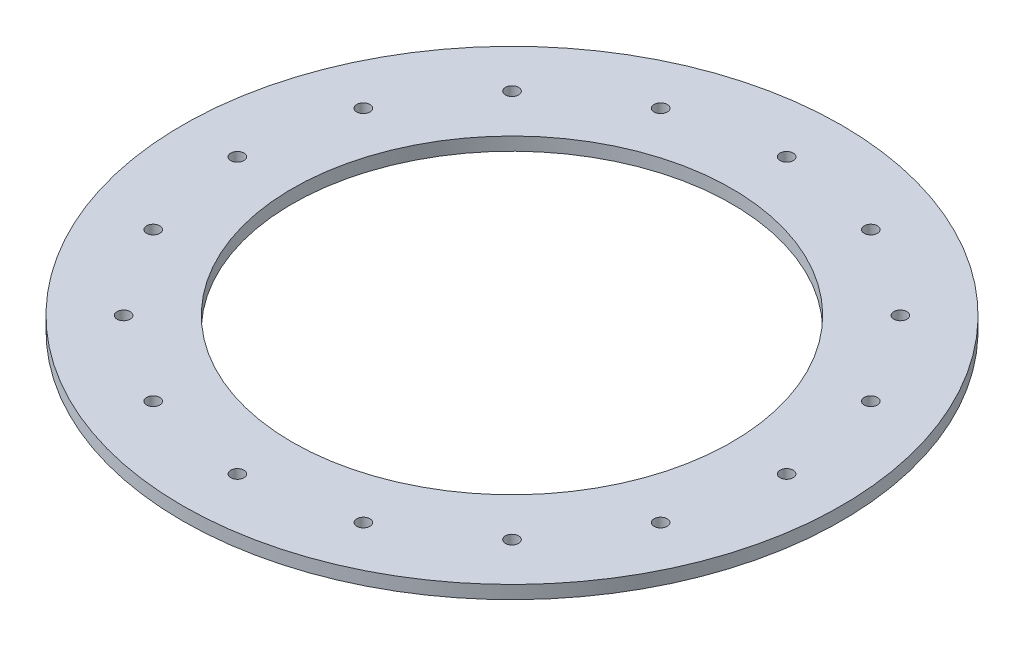
ISO-10303-21;
HEADER;
FILE_DESCRIPTION(('STEP AP214'),'2;1');
FILE_NAME('part.step','',(''),(''),'','','');
FILE_SCHEMA(('AUTOMOTIVE_DESIGN { 1 0 10303 214 1 1 1 1 }'));
ENDSEC;
DATA;
#1=APPLICATION_CONTEXT('core data for automotive mechanical design processes');
#2=APPLICATION_PROTOCOL_DEFINITION('international standard','automotive_design',2000,#1);
#3=PRODUCT_CONTEXT('',#1,'mechanical');
#4=PRODUCT('Part','Part','',(#3));
#5=PRODUCT_RELATED_PRODUCT_CATEGORY('part','',(#4));
#6=PRODUCT_DEFINITION_FORMATION('','',#4);
#7=PRODUCT_DEFINITION_CONTEXT('part definition',#1,'design');
#8=PRODUCT_DEFINITION('design','',#6,#7);
#9=PRODUCT_DEFINITION_SHAPE('','',#8);
#10=(LENGTH_UNIT() NAMED_UNIT(*) SI_UNIT(.MILLI.,.METRE.));
#11=(NAMED_UNIT(*) PLANE_ANGLE_UNIT() SI_UNIT($,.RADIAN.));
#12=(NAMED_UNIT(*) SI_UNIT($,.STERADIAN.) SOLID_ANGLE_UNIT());
#13=UNCERTAINTY_MEASURE_WITH_UNIT(LENGTH_MEASURE(1.E-05),#10,'distance_accuracy_value','');
#14=(GEOMETRIC_REPRESENTATION_CONTEXT(3) GLOBAL_UNCERTAINTY_ASSIGNED_CONTEXT((#13)) GLOBAL_UNIT_ASSIGNED_CONTEXT((#10,
#11,#12)) REPRESENTATION_CONTEXT('',''));
#15=CARTESIAN_POINT('',(0.,0.,0.));
#16=DIRECTION('',(0.,0.,1.));
#17=DIRECTION('',(1.,0.,0.));
#18=AXIS2_PLACEMENT_3D('',#15,#16,#17);
#19=CARTESIAN_POINT('',(0.,1.5,0.));
#20=DIRECTION('',(0.,1.,0.));
#21=DIRECTION('',(0.,0.,1.));
#22=AXIS2_PLACEMENT_3D('',#19,#20,#21);
#23=PLANE('',#22);
#24=CARTESIAN_POINT('',(-22.0970869120796,1.5,-22.0970869120796));
#25=DIRECTION('',(0.,1.,0.));
#26=DIRECTION('',(0.,0.,1.));
#27=AXIS2_PLACEMENT_3D('',#24,#25,#26);
#28=CIRCLE('',#27,0.750000000000002);
#29=CARTESIAN_POINT('',(-22.0970869120796,1.5,-21.3470869120796));
#30=VERTEX_POINT('',#29);
#31=EDGE_CURVE('E131',#30,#30,#28,.T.);
#32=ORIENTED_EDGE('',*,*,#31,.F.);
#33=EDGE_LOOP('',(#32));
#34=FACE_BOUND('',#33,.T.);
#35=CARTESIAN_POINT('',(-31.25,1.5,0.));
#36=DIRECTION('',(0.,1.,0.));
#37=DIRECTION('',(0.,0.,1.));
#38=AXIS2_PLACEMENT_3D('',#35,#36,#37);
#39=CIRCLE('',#38,0.749999999999998);
#40=CARTESIAN_POINT('',(-31.25,1.5,0.750000000000004));
#41=VERTEX_POINT('',#40);
#42=EDGE_CURVE('E119',#41,#41,#39,.T.);
#43=ORIENTED_EDGE('',*,*,#42,.F.);
#44=EDGE_LOOP('',(#43));
#45=FACE_BOUND('',#44,.T.);
#46=CARTESIAN_POINT('',(-22.0970869120796,1.5,22.0970869120796));
#47=DIRECTION('',(0.,1.,0.));
#48=DIRECTION('',(0.,0.,1.));
#49=AXIS2_PLACEMENT_3D('',#46,#47,#48);
#50=CIRCLE('',#49,0.750000000000002);
#51=CARTESIAN_POINT('',(-22.0970869120796,1.5,22.8470869120796));
#52=VERTEX_POINT('',#51);
#53=EDGE_CURVE('E107',#52,#52,#50,.T.);
#54=ORIENTED_EDGE('',*,*,#53,.F.);
#55=EDGE_LOOP('',(#54));
#56=FACE_BOUND('',#55,.T.);
#57=CARTESIAN_POINT('',(0.,1.5,31.25));
#58=DIRECTION('',(0.,1.,0.));
#59=DIRECTION('',(0.,0.,1.));
#60=AXIS2_PLACEMENT_3D('',#57,#58,#59);
#61=CIRCLE('',#60,0.750000000000001);
#62=CARTESIAN_POINT('',(0.,1.5,32.));
#63=VERTEX_POINT('',#62);
#64=EDGE_CURVE('E95',#63,#63,#61,.T.);
#65=ORIENTED_EDGE('',*,*,#64,.F.);
#66=EDGE_LOOP('',(#65));
#67=FACE_BOUND('',#66,.T.);
#68=CARTESIAN_POINT('',(22.0970869120796,1.5,22.0970869120796));
#69=DIRECTION('',(0.,1.,0.));
#70=DIRECTION('',(0.,0.,1.));
#71=AXIS2_PLACEMENT_3D('',#68,#69,#70);
#72=CIRCLE('',#71,0.750000000000002);
#73=CARTESIAN_POINT('',(22.0970869120796,1.5,22.8470869120796));
#74=VERTEX_POINT('',#73);
#75=EDGE_CURVE('E83',#74,#74,#72,.T.);
#76=ORIENTED_EDGE('',*,*,#75,.F.);
#77=EDGE_LOOP('',(#76));
#78=FACE_BOUND('',#77,.T.);
#79=CARTESIAN_POINT('',(31.25,1.5,0.));
#80=DIRECTION('',(0.,1.,0.));
#81=DIRECTION('',(0.,0.,1.));
#82=AXIS2_PLACEMENT_3D('',#79,#80,#81);
#83=CIRCLE('',#82,0.7500000000001);
#84=CARTESIAN_POINT('',(31.25,1.5,0.750000000000098));
#85=VERTEX_POINT('',#84);
#86=EDGE_CURVE('E71',#85,#85,#83,.T.);
#87=ORIENTED_EDGE('',*,*,#86,.F.);
#88=EDGE_LOOP('',(#87));
#89=FACE_BOUND('',#88,.T.);
#90=CARTESIAN_POINT('',(22.0970869120796,1.5,-22.0970869120796));
#91=DIRECTION('',(0.,1.,0.));
#92=DIRECTION('',(0.,0.,1.));
#93=AXIS2_PLACEMENT_3D('',#90,#91,#92);
#94=CIRCLE('',#93,0.750000000000053);
#95=CARTESIAN_POINT('',(22.0970869120796,1.5,-21.3470869120796));
#96=VERTEX_POINT('',#95);
#97=EDGE_CURVE('E59',#96,#96,#94,.T.);
#98=ORIENTED_EDGE('',*,*,#97,.F.);
#99=EDGE_LOOP('',(#98));
#100=FACE_BOUND('',#99,.T.);
#101=CARTESIAN_POINT('',(0.,1.5,-31.25));
#102=DIRECTION('',(0.,1.,0.));
#103=DIRECTION('',(0.,0.,1.));
#104=AXIS2_PLACEMENT_3D('',#101,#102,#103);
#105=CIRCLE('',#104,0.750000000000001);
#106=CARTESIAN_POINT('',(0.,1.5,-30.5));
#107=VERTEX_POINT('',#106);
#108=EDGE_CURVE('E47',#107,#107,#105,.T.);
#109=ORIENTED_EDGE('',*,*,#108,.F.);
#110=EDGE_LOOP('',(#109));
#111=FACE_BOUND('',#110,.T.);
#112=CARTESIAN_POINT('',(0.,1.5,0.));
#113=DIRECTION('',(0.,1.,0.));
#114=DIRECTION('',(0.,0.,1.));
#115=AXIS2_PLACEMENT_3D('',#112,#113,#114);
#116=CIRCLE('',#115,37.5);
#117=CARTESIAN_POINT('',(0.,1.5,37.5));
#118=VERTEX_POINT('',#117);
#119=EDGE_CURVE('E10',#118,#118,#116,.T.);
#120=ORIENTED_EDGE('',*,*,#119,.T.);
#121=EDGE_LOOP('',(#120));
#122=FACE_BOUND('',#121,.T.);
#123=CARTESIAN_POINT('',(0.,1.5,0.));
#124=DIRECTION('',(0.,1.,0.));
#125=DIRECTION('',(0.,0.,1.));
#126=AXIS2_PLACEMENT_3D('',#123,#124,#125);
#127=CIRCLE('',#126,25.);
#128=CARTESIAN_POINT('',(0.,1.5,25.));
#129=VERTEX_POINT('',#128);
#130=EDGE_CURVE('E42',#129,#129,#127,.T.);
#131=ORIENTED_EDGE('',*,*,#130,.F.);
#132=EDGE_LOOP('',(#131));
#133=FACE_BOUND('',#132,.T.);
#134=CARTESIAN_POINT('',(11.958857261409,1.5,-28.8712353909777));
#135=DIRECTION('',(0.,1.,0.));
#136=DIRECTION('',(0.,0.,1.));
#137=AXIS2_PLACEMENT_3D('',#134,#135,#136);
#138=CIRCLE('',#137,0.750000000000002);
#139=CARTESIAN_POINT('',(11.958857261409,1.5,-28.1212353909777));
#140=VERTEX_POINT('',#139);
#141=EDGE_CURVE('E53',#140,#140,#138,.T.);
#142=ORIENTED_EDGE('',*,*,#141,.F.);
#143=EDGE_LOOP('',(#142));
#144=FACE_BOUND('',#143,.T.);
#145=CARTESIAN_POINT('',(28.8712353909777,1.5,-11.9588572614091));
#146=DIRECTION('',(0.,1.,0.));
#147=DIRECTION('',(0.,0.,1.));
#148=AXIS2_PLACEMENT_3D('',#145,#146,#147);
#149=CIRCLE('',#148,0.750000000000082);
#150=CARTESIAN_POINT('',(28.8712353909777,1.5,-11.208857261409));
#151=VERTEX_POINT('',#150);
#152=EDGE_CURVE('E65',#151,#151,#149,.T.);
#153=ORIENTED_EDGE('',*,*,#152,.F.);
#154=EDGE_LOOP('',(#153));
#155=FACE_BOUND('',#154,.T.);
#156=CARTESIAN_POINT('',(28.8712353909777,1.5,11.9588572614091));
#157=DIRECTION('',(0.,1.,0.));
#158=DIRECTION('',(0.,0.,1.));
#159=AXIS2_PLACEMENT_3D('',#156,#157,#158);
#160=CIRCLE('',#159,0.750000000000125);
#161=CARTESIAN_POINT('',(28.8712353909777,1.5,12.7088572614092));
#162=VERTEX_POINT('',#161);
#163=EDGE_CURVE('E77',#162,#162,#160,.T.);
#164=ORIENTED_EDGE('',*,*,#163,.F.);
#165=EDGE_LOOP('',(#164));
#166=FACE_BOUND('',#165,.T.);
#167=CARTESIAN_POINT('',(11.9588572614091,1.5,28.8712353909777));
#168=DIRECTION('',(0.,1.,0.));
#169=DIRECTION('',(0.,0.,1.));
#170=AXIS2_PLACEMENT_3D('',#167,#168,#169);
#171=CIRCLE('',#170,0.75);
#172=CARTESIAN_POINT('',(11.9588572614091,1.5,29.6212353909777));
#173=VERTEX_POINT('',#172);
#174=EDGE_CURVE('E89',#173,#173,#171,.T.);
#175=ORIENTED_EDGE('',*,*,#174,.F.);
#176=EDGE_LOOP('',(#175));
#177=FACE_BOUND('',#176,.T.);
#178=CARTESIAN_POINT('',(-11.9588572614091,1.5,28.8712353909777));
#179=DIRECTION('',(0.,1.,0.));
#180=DIRECTION('',(0.,0.,1.));
#181=AXIS2_PLACEMENT_3D('',#178,#179,#180);
#182=CIRCLE('',#181,0.75);
#183=CARTESIAN_POINT('',(-11.9588572614091,1.5,29.6212353909777));
#184=VERTEX_POINT('',#183);
#185=EDGE_CURVE('E101',#184,#184,#182,.T.);
#186=ORIENTED_EDGE('',*,*,#185,.F.);
#187=EDGE_LOOP('',(#186));
#188=FACE_BOUND('',#187,.T.);
#189=CARTESIAN_POINT('',(-28.8712353909777,1.5,11.9588572614091));
#190=DIRECTION('',(0.,1.,0.));
#191=DIRECTION('',(0.,0.,1.));
#192=AXIS2_PLACEMENT_3D('',#189,#190,#191);
#193=CIRCLE('',#192,0.750000000000002);
#194=CARTESIAN_POINT('',(-28.8712353909777,1.5,12.7088572614091));
#195=VERTEX_POINT('',#194);
#196=EDGE_CURVE('E113',#195,#195,#193,.T.);
#197=ORIENTED_EDGE('',*,*,#196,.F.);
#198=EDGE_LOOP('',(#197));
#199=FACE_BOUND('',#198,.T.);
#200=CARTESIAN_POINT('',(-28.8712353909777,1.5,-11.9588572614091));
#201=DIRECTION('',(0.,1.,0.));
#202=DIRECTION('',(0.,0.,1.));
#203=AXIS2_PLACEMENT_3D('',#200,#201,#202);
#204=CIRCLE('',#203,0.750000000000002);
#205=CARTESIAN_POINT('',(-28.8712353909777,1.5,-11.2088572614091));
#206=VERTEX_POINT('',#205);
#207=EDGE_CURVE('E125',#206,#206,#204,.T.);
#208=ORIENTED_EDGE('',*,*,#207,.F.);
#209=EDGE_LOOP('',(#208));
#210=FACE_BOUND('',#209,.T.);
#211=CARTESIAN_POINT('',(-11.9588572614091,1.5,-28.8712353909777));
#212=DIRECTION('',(0.,1.,0.));
#213=DIRECTION('',(0.,0.,1.));
#214=AXIS2_PLACEMENT_3D('',#211,#212,#213);
#215=CIRCLE('',#214,0.749999999999999);
#216=CARTESIAN_POINT('',(-11.9588572614091,1.5,-28.1212353909777));
#217=VERTEX_POINT('',#216);
#218=EDGE_CURVE('E137',#217,#217,#215,.T.);
#219=ORIENTED_EDGE('',*,*,#218,.F.);
#220=EDGE_LOOP('',(#219));
#221=FACE_BOUND('',#220,.T.);
#222=ADVANCED_FACE('F31',(#34,#45,#56,#67,#78,#89,#100,#111,#122,#133,#144,#155,#166,#177,#188,
#199,#210,#221),#23,.T.);
#223=CARTESIAN_POINT('',(0.,0.,0.));
#224=DIRECTION('',(0.,1.,0.));
#225=DIRECTION('',(0.,0.,1.));
#226=AXIS2_PLACEMENT_3D('',#223,#224,#225);
#227=PLANE('',#226);
#228=CARTESIAN_POINT('',(0.,0.,0.));
#229=DIRECTION('',(0.,1.,0.));
#230=DIRECTION('',(0.,0.,1.));
#231=AXIS2_PLACEMENT_3D('',#228,#229,#230);
#232=CIRCLE('',#231,37.5);
#233=CARTESIAN_POINT('',(0.,0.,37.5));
#234=VERTEX_POINT('',#233);
#235=EDGE_CURVE('E35',#234,#234,#232,.T.);
#236=ORIENTED_EDGE('',*,*,#235,.F.);
#237=EDGE_LOOP('',(#236));
#238=FACE_BOUND('',#237,.T.);
#239=CARTESIAN_POINT('',(0.,0.,0.));
#240=DIRECTION('',(0.,1.,0.));
#241=DIRECTION('',(0.,0.,1.));
#242=AXIS2_PLACEMENT_3D('',#239,#240,#241);
#243=CIRCLE('',#242,25.);
#244=CARTESIAN_POINT('',(0.,0.,25.));
#245=VERTEX_POINT('',#244);
#246=EDGE_CURVE('E44',#245,#245,#243,.T.);
#247=ORIENTED_EDGE('',*,*,#246,.T.);
#248=EDGE_LOOP('',(#247));
#249=FACE_BOUND('',#248,.T.);
#250=CARTESIAN_POINT('',(0.,0.,-31.25));
#251=DIRECTION('',(0.,1.,0.));
#252=DIRECTION('',(0.,0.,1.));
#253=AXIS2_PLACEMENT_3D('',#250,#251,#252);
#254=CIRCLE('',#253,0.750000000000001);
#255=CARTESIAN_POINT('',(0.,0.,-30.5));
#256=VERTEX_POINT('',#255);
#257=EDGE_CURVE('E50',#256,#256,#254,.T.);
#258=ORIENTED_EDGE('',*,*,#257,.T.);
#259=EDGE_LOOP('',(#258));
#260=FACE_BOUND('',#259,.T.);
#261=CARTESIAN_POINT('',(11.958857261409,0.,-28.8712353909777));
#262=DIRECTION('',(0.,1.,0.));
#263=DIRECTION('',(0.,0.,1.));
#264=AXIS2_PLACEMENT_3D('',#261,#262,#263);
#265=CIRCLE('',#264,0.750000000000002);
#266=CARTESIAN_POINT('',(11.958857261409,0.,-28.1212353909777));
#267=VERTEX_POINT('',#266);
#268=EDGE_CURVE('E56',#267,#267,#265,.T.);
#269=ORIENTED_EDGE('',*,*,#268,.T.);
#270=EDGE_LOOP('',(#269));
#271=FACE_BOUND('',#270,.T.);
#272=CARTESIAN_POINT('',(22.0970869120796,0.,-22.0970869120796));
#273=DIRECTION('',(0.,1.,0.));
#274=DIRECTION('',(0.,0.,1.));
#275=AXIS2_PLACEMENT_3D('',#272,#273,#274);
#276=CIRCLE('',#275,0.750000000000053);
#277=CARTESIAN_POINT('',(22.0970869120796,0.,-21.3470869120796));
#278=VERTEX_POINT('',#277);
#279=EDGE_CURVE('E62',#278,#278,#276,.T.);
#280=ORIENTED_EDGE('',*,*,#279,.T.);
#281=EDGE_LOOP('',(#280));
#282=FACE_BOUND('',#281,.T.);
#283=CARTESIAN_POINT('',(28.8712353909777,0.,-11.9588572614091));
#284=DIRECTION('',(0.,1.,0.));
#285=DIRECTION('',(0.,0.,1.));
#286=AXIS2_PLACEMENT_3D('',#283,#284,#285);
#287=CIRCLE('',#286,0.750000000000082);
#288=CARTESIAN_POINT('',(28.8712353909777,0.,-11.208857261409));
#289=VERTEX_POINT('',#288);
#290=EDGE_CURVE('E68',#289,#289,#287,.T.);
#291=ORIENTED_EDGE('',*,*,#290,.T.);
#292=EDGE_LOOP('',(#291));
#293=FACE_BOUND('',#292,.T.);
#294=CARTESIAN_POINT('',(31.25,0.,0.));
#295=DIRECTION('',(0.,1.,0.));
#296=DIRECTION('',(0.,0.,1.));
#297=AXIS2_PLACEMENT_3D('',#294,#295,#296);
#298=CIRCLE('',#297,0.7500000000001);
#299=CARTESIAN_POINT('',(31.25,0.,0.750000000000098));
#300=VERTEX_POINT('',#299);
#301=EDGE_CURVE('E74',#300,#300,#298,.T.);
#302=ORIENTED_EDGE('',*,*,#301,.T.);
#303=EDGE_LOOP('',(#302));
#304=FACE_BOUND('',#303,.T.);
#305=CARTESIAN_POINT('',(28.8712353909777,0.,11.9588572614091));
#306=DIRECTION('',(0.,1.,0.));
#307=DIRECTION('',(0.,0.,1.));
#308=AXIS2_PLACEMENT_3D('',#305,#306,#307);
#309=CIRCLE('',#308,0.750000000000125);
#310=CARTESIAN_POINT('',(28.8712353909777,0.,12.7088572614092));
#311=VERTEX_POINT('',#310);
#312=EDGE_CURVE('E80',#311,#311,#309,.T.);
#313=ORIENTED_EDGE('',*,*,#312,.T.);
#314=EDGE_LOOP('',(#313));
#315=FACE_BOUND('',#314,.T.);
#316=CARTESIAN_POINT('',(22.0970869120796,0.,22.0970869120796));
#317=DIRECTION('',(0.,1.,0.));
#318=DIRECTION('',(0.,0.,1.));
#319=AXIS2_PLACEMENT_3D('',#316,#317,#318);
#320=CIRCLE('',#319,0.750000000000002);
#321=CARTESIAN_POINT('',(22.0970869120796,0.,22.8470869120796));
#322=VERTEX_POINT('',#321);
#323=EDGE_CURVE('E86',#322,#322,#320,.T.);
#324=ORIENTED_EDGE('',*,*,#323,.T.);
#325=EDGE_LOOP('',(#324));
#326=FACE_BOUND('',#325,.T.);
#327=CARTESIAN_POINT('',(11.9588572614091,0.,28.8712353909777));
#328=DIRECTION('',(0.,1.,0.));
#329=DIRECTION('',(0.,0.,1.));
#330=AXIS2_PLACEMENT_3D('',#327,#328,#329);
#331=CIRCLE('',#330,0.75);
#332=CARTESIAN_POINT('',(11.9588572614091,0.,29.6212353909777));
#333=VERTEX_POINT('',#332);
#334=EDGE_CURVE('E92',#333,#333,#331,.T.);
#335=ORIENTED_EDGE('',*,*,#334,.T.);
#336=EDGE_LOOP('',(#335));
#337=FACE_BOUND('',#336,.T.);
#338=CARTESIAN_POINT('',(0.,0.,31.25));
#339=DIRECTION('',(0.,1.,0.));
#340=DIRECTION('',(0.,0.,1.));
#341=AXIS2_PLACEMENT_3D('',#338,#339,#340);
#342=CIRCLE('',#341,0.750000000000001);
#343=CARTESIAN_POINT('',(0.,0.,32.));
#344=VERTEX_POINT('',#343);
#345=EDGE_CURVE('E98',#344,#344,#342,.T.);
#346=ORIENTED_EDGE('',*,*,#345,.T.);
#347=EDGE_LOOP('',(#346));
#348=FACE_BOUND('',#347,.T.);
#349=CARTESIAN_POINT('',(-11.9588572614091,0.,28.8712353909777));
#350=DIRECTION('',(0.,1.,0.));
#351=DIRECTION('',(0.,0.,1.));
#352=AXIS2_PLACEMENT_3D('',#349,#350,#351);
#353=CIRCLE('',#352,0.75);
#354=CARTESIAN_POINT('',(-11.9588572614091,0.,29.6212353909777));
#355=VERTEX_POINT('',#354);
#356=EDGE_CURVE('E104',#355,#355,#353,.T.);
#357=ORIENTED_EDGE('',*,*,#356,.T.);
#358=EDGE_LOOP('',(#357));
#359=FACE_BOUND('',#358,.T.);
#360=CARTESIAN_POINT('',(-22.0970869120796,0.,22.0970869120796));
#361=DIRECTION('',(0.,1.,0.));
#362=DIRECTION('',(0.,0.,1.));
#363=AXIS2_PLACEMENT_3D('',#360,#361,#362);
#364=CIRCLE('',#363,0.750000000000002);
#365=CARTESIAN_POINT('',(-22.0970869120796,0.,22.8470869120796));
#366=VERTEX_POINT('',#365);
#367=EDGE_CURVE('E110',#366,#366,#364,.T.);
#368=ORIENTED_EDGE('',*,*,#367,.T.);
#369=EDGE_LOOP('',(#368));
#370=FACE_BOUND('',#369,.T.);
#371=CARTESIAN_POINT('',(-28.8712353909777,0.,11.9588572614091));
#372=DIRECTION('',(0.,1.,0.));
#373=DIRECTION('',(0.,0.,1.));
#374=AXIS2_PLACEMENT_3D('',#371,#372,#373);
#375=CIRCLE('',#374,0.750000000000002);
#376=CARTESIAN_POINT('',(-28.8712353909777,0.,12.7088572614091));
#377=VERTEX_POINT('',#376);
#378=EDGE_CURVE('E116',#377,#377,#375,.T.);
#379=ORIENTED_EDGE('',*,*,#378,.T.);
#380=EDGE_LOOP('',(#379));
#381=FACE_BOUND('',#380,.T.);
#382=CARTESIAN_POINT('',(-31.25,0.,0.));
#383=DIRECTION('',(0.,1.,0.));
#384=DIRECTION('',(0.,0.,1.));
#385=AXIS2_PLACEMENT_3D('',#382,#383,#384);
#386=CIRCLE('',#385,0.749999999999998);
#387=CARTESIAN_POINT('',(-31.25,0.,0.750000000000004));
#388=VERTEX_POINT('',#387);
#389=EDGE_CURVE('E122',#388,#388,#386,.T.);
#390=ORIENTED_EDGE('',*,*,#389,.T.);
#391=EDGE_LOOP('',(#390));
#392=FACE_BOUND('',#391,.T.);
#393=CARTESIAN_POINT('',(-28.8712353909777,0.,-11.9588572614091));
#394=DIRECTION('',(0.,1.,0.));
#395=DIRECTION('',(0.,0.,1.));
#396=AXIS2_PLACEMENT_3D('',#393,#394,#395);
#397=CIRCLE('',#396,0.750000000000002);
#398=CARTESIAN_POINT('',(-28.8712353909777,0.,-11.2088572614091));
#399=VERTEX_POINT('',#398);
#400=EDGE_CURVE('E128',#399,#399,#397,.T.);
#401=ORIENTED_EDGE('',*,*,#400,.T.);
#402=EDGE_LOOP('',(#401));
#403=FACE_BOUND('',#402,.T.);
#404=CARTESIAN_POINT('',(-22.0970869120796,0.,-22.0970869120796));
#405=DIRECTION('',(0.,1.,0.));
#406=DIRECTION('',(0.,0.,1.));
#407=AXIS2_PLACEMENT_3D('',#404,#405,#406);
#408=CIRCLE('',#407,0.750000000000002);
#409=CARTESIAN_POINT('',(-22.0970869120796,0.,-21.3470869120796));
#410=VERTEX_POINT('',#409);
#411=EDGE_CURVE('E134',#410,#410,#408,.T.);
#412=ORIENTED_EDGE('',*,*,#411,.T.);
#413=EDGE_LOOP('',(#412));
#414=FACE_BOUND('',#413,.T.);
#415=CARTESIAN_POINT('',(-11.9588572614091,0.,-28.8712353909777));
#416=DIRECTION('',(0.,1.,0.));
#417=DIRECTION('',(0.,0.,1.));
#418=AXIS2_PLACEMENT_3D('',#415,#416,#417);
#419=CIRCLE('',#418,0.749999999999999);
#420=CARTESIAN_POINT('',(-11.9588572614091,0.,-28.1212353909777));
#421=VERTEX_POINT('',#420);
#422=EDGE_CURVE('E140',#421,#421,#419,.T.);
#423=ORIENTED_EDGE('',*,*,#422,.T.);
#424=EDGE_LOOP('',(#423));
#425=FACE_BOUND('',#424,.T.);
#426=ADVANCED_FACE('F150',(#238,#249,#260,#271,#282,#293,#304,#315,#326,#337,#348,#359,#370,
#381,#392,#403,#414,#425),#227,.F.);
#427=CARTESIAN_POINT('',(0.,1.5,0.));
#428=DIRECTION('',(0.,-1.,0.));
#429=DIRECTION('',(0.,0.,-1.));
#430=AXIS2_PLACEMENT_3D('',#427,#428,#429);
#431=CYLINDRICAL_SURFACE('',#430,37.5);
#432=ORIENTED_EDGE('',*,*,#119,.F.);
#433=EDGE_LOOP('',(#432));
#434=FACE_BOUND('',#433,.T.);
#435=ORIENTED_EDGE('',*,*,#235,.T.);
#436=EDGE_LOOP('',(#435));
#437=FACE_BOUND('',#436,.T.);
#438=ADVANCED_FACE('F33',(#434,#437),#431,.T.);
#439=CARTESIAN_POINT('',(0.,1.5,0.));
#440=DIRECTION('',(0.,-1.,0.));
#441=DIRECTION('',(0.,0.,-1.));
#442=AXIS2_PLACEMENT_3D('',#439,#440,#441);
#443=CYLINDRICAL_SURFACE('',#442,25.);
#444=ORIENTED_EDGE('',*,*,#130,.T.);
#445=EDGE_LOOP('',(#444));
#446=FACE_BOUND('',#445,.T.);
#447=ORIENTED_EDGE('',*,*,#246,.F.);
#448=EDGE_LOOP('',(#447));
#449=FACE_BOUND('',#448,.T.);
#450=ADVANCED_FACE('F160',(#446,#449),#443,.F.);
#451=CARTESIAN_POINT('',(0.,1.5,-31.25));
#452=DIRECTION('',(0.,-1.,0.));
#453=DIRECTION('',(0.,0.,-1.));
#454=AXIS2_PLACEMENT_3D('',#451,#452,#453);
#455=CYLINDRICAL_SURFACE('',#454,0.750000000000001);
#456=ORIENTED_EDGE('',*,*,#108,.T.);
#457=EDGE_LOOP('',(#456));
#458=FACE_BOUND('',#457,.T.);
#459=ORIENTED_EDGE('',*,*,#257,.F.);
#460=EDGE_LOOP('',(#459));
#461=FACE_BOUND('',#460,.T.);
#462=ADVANCED_FACE('F163',(#458,#461),#455,.F.);
#463=CARTESIAN_POINT('',(11.958857261409,1.5,-28.8712353909777));
#464=DIRECTION('',(0.,-1.,0.));
#465=DIRECTION('',(0.,0.,-1.));
#466=AXIS2_PLACEMENT_3D('',#463,#464,#465);
#467=CYLINDRICAL_SURFACE('',#466,0.750000000000002);
#468=ORIENTED_EDGE('',*,*,#141,.T.);
#469=EDGE_LOOP('',(#468));
#470=FACE_BOUND('',#469,.T.);
#471=ORIENTED_EDGE('',*,*,#268,.F.);
#472=EDGE_LOOP('',(#471));
#473=FACE_BOUND('',#472,.T.);
#474=ADVANCED_FACE('F167',(#470,#473),#467,.F.);
#475=CARTESIAN_POINT('',(22.0970869120796,1.5,-22.0970869120796));
#476=DIRECTION('',(0.,-1.,0.));
#477=DIRECTION('',(0.,0.,-1.));
#478=AXIS2_PLACEMENT_3D('',#475,#476,#477);
#479=CYLINDRICAL_SURFACE('',#478,0.750000000000053);
#480=ORIENTED_EDGE('',*,*,#97,.T.);
#481=EDGE_LOOP('',(#480));
#482=FACE_BOUND('',#481,.T.);
#483=ORIENTED_EDGE('',*,*,#279,.F.);
#484=EDGE_LOOP('',(#483));
#485=FACE_BOUND('',#484,.T.);
#486=ADVANCED_FACE('F171',(#482,#485),#479,.F.);
#487=CARTESIAN_POINT('',(28.8712353909777,1.5,-11.9588572614091));
#488=DIRECTION('',(0.,-1.,0.));
#489=DIRECTION('',(0.,0.,-1.));
#490=AXIS2_PLACEMENT_3D('',#487,#488,#489);
#491=CYLINDRICAL_SURFACE('',#490,0.750000000000082);
#492=ORIENTED_EDGE('',*,*,#152,.T.);
#493=EDGE_LOOP('',(#492));
#494=FACE_BOUND('',#493,.T.);
#495=ORIENTED_EDGE('',*,*,#290,.F.);
#496=EDGE_LOOP('',(#495));
#497=FACE_BOUND('',#496,.T.);
#498=ADVANCED_FACE('F175',(#494,#497),#491,.F.);
#499=CARTESIAN_POINT('',(31.25,1.5,0.));
#500=DIRECTION('',(0.,-1.,0.));
#501=DIRECTION('',(0.,0.,-1.));
#502=AXIS2_PLACEMENT_3D('',#499,#500,#501);
#503=CYLINDRICAL_SURFACE('',#502,0.7500000000001);
#504=ORIENTED_EDGE('',*,*,#86,.T.);
#505=EDGE_LOOP('',(#504));
#506=FACE_BOUND('',#505,.T.);
#507=ORIENTED_EDGE('',*,*,#301,.F.);
#508=EDGE_LOOP('',(#507));
#509=FACE_BOUND('',#508,.T.);
#510=ADVANCED_FACE('F179',(#506,#509),#503,.F.);
#511=CARTESIAN_POINT('',(28.8712353909777,1.5,11.9588572614091));
#512=DIRECTION('',(0.,-1.,0.));
#513=DIRECTION('',(0.,0.,-1.));
#514=AXIS2_PLACEMENT_3D('',#511,#512,#513);
#515=CYLINDRICAL_SURFACE('',#514,0.750000000000125);
#516=ORIENTED_EDGE('',*,*,#163,.T.);
#517=EDGE_LOOP('',(#516));
#518=FACE_BOUND('',#517,.T.);
#519=ORIENTED_EDGE('',*,*,#312,.F.);
#520=EDGE_LOOP('',(#519));
#521=FACE_BOUND('',#520,.T.);
#522=ADVANCED_FACE('F183',(#518,#521),#515,.F.);
#523=CARTESIAN_POINT('',(22.0970869120796,1.5,22.0970869120796));
#524=DIRECTION('',(0.,-1.,0.));
#525=DIRECTION('',(0.,0.,-1.));
#526=AXIS2_PLACEMENT_3D('',#523,#524,#525);
#527=CYLINDRICAL_SURFACE('',#526,0.750000000000002);
#528=ORIENTED_EDGE('',*,*,#75,.T.);
#529=EDGE_LOOP('',(#528));
#530=FACE_BOUND('',#529,.T.);
#531=ORIENTED_EDGE('',*,*,#323,.F.);
#532=EDGE_LOOP('',(#531));
#533=FACE_BOUND('',#532,.T.);
#534=ADVANCED_FACE('F187',(#530,#533),#527,.F.);
#535=CARTESIAN_POINT('',(11.9588572614091,1.5,28.8712353909777));
#536=DIRECTION('',(0.,-1.,0.));
#537=DIRECTION('',(0.,0.,-1.));
#538=AXIS2_PLACEMENT_3D('',#535,#536,#537);
#539=CYLINDRICAL_SURFACE('',#538,0.75);
#540=ORIENTED_EDGE('',*,*,#174,.T.);
#541=EDGE_LOOP('',(#540));
#542=FACE_BOUND('',#541,.T.);
#543=ORIENTED_EDGE('',*,*,#334,.F.);
#544=EDGE_LOOP('',(#543));
#545=FACE_BOUND('',#544,.T.);
#546=ADVANCED_FACE('F191',(#542,#545),#539,.F.);
#547=CARTESIAN_POINT('',(0.,1.5,31.25));
#548=DIRECTION('',(0.,-1.,0.));
#549=DIRECTION('',(0.,0.,-1.));
#550=AXIS2_PLACEMENT_3D('',#547,#548,#549);
#551=CYLINDRICAL_SURFACE('',#550,0.750000000000001);
#552=ORIENTED_EDGE('',*,*,#64,.T.);
#553=EDGE_LOOP('',(#552));
#554=FACE_BOUND('',#553,.T.);
#555=ORIENTED_EDGE('',*,*,#345,.F.);
#556=EDGE_LOOP('',(#555));
#557=FACE_BOUND('',#556,.T.);
#558=ADVANCED_FACE('F195',(#554,#557),#551,.F.);
#559=CARTESIAN_POINT('',(-11.9588572614091,1.5,28.8712353909777));
#560=DIRECTION('',(0.,-1.,0.));
#561=DIRECTION('',(0.,0.,-1.));
#562=AXIS2_PLACEMENT_3D('',#559,#560,#561);
#563=CYLINDRICAL_SURFACE('',#562,0.75);
#564=ORIENTED_EDGE('',*,*,#185,.T.);
#565=EDGE_LOOP('',(#564));
#566=FACE_BOUND('',#565,.T.);
#567=ORIENTED_EDGE('',*,*,#356,.F.);
#568=EDGE_LOOP('',(#567));
#569=FACE_BOUND('',#568,.T.);
#570=ADVANCED_FACE('F199',(#566,#569),#563,.F.);
#571=CARTESIAN_POINT('',(-22.0970869120796,1.5,22.0970869120796));
#572=DIRECTION('',(0.,-1.,0.));
#573=DIRECTION('',(0.,0.,-1.));
#574=AXIS2_PLACEMENT_3D('',#571,#572,#573);
#575=CYLINDRICAL_SURFACE('',#574,0.750000000000002);
#576=ORIENTED_EDGE('',*,*,#53,.T.);
#577=EDGE_LOOP('',(#576));
#578=FACE_BOUND('',#577,.T.);
#579=ORIENTED_EDGE('',*,*,#367,.F.);
#580=EDGE_LOOP('',(#579));
#581=FACE_BOUND('',#580,.T.);
#582=ADVANCED_FACE('F203',(#578,#581),#575,.F.);
#583=CARTESIAN_POINT('',(-28.8712353909777,1.5,11.9588572614091));
#584=DIRECTION('',(0.,-1.,0.));
#585=DIRECTION('',(0.,0.,-1.));
#586=AXIS2_PLACEMENT_3D('',#583,#584,#585);
#587=CYLINDRICAL_SURFACE('',#586,0.750000000000002);
#588=ORIENTED_EDGE('',*,*,#196,.T.);
#589=EDGE_LOOP('',(#588));
#590=FACE_BOUND('',#589,.T.);
#591=ORIENTED_EDGE('',*,*,#378,.F.);
#592=EDGE_LOOP('',(#591));
#593=FACE_BOUND('',#592,.T.);
#594=ADVANCED_FACE('F207',(#590,#593),#587,.F.);
#595=CARTESIAN_POINT('',(-31.25,1.5,0.));
#596=DIRECTION('',(0.,-1.,0.));
#597=DIRECTION('',(0.,0.,-1.));
#598=AXIS2_PLACEMENT_3D('',#595,#596,#597);
#599=CYLINDRICAL_SURFACE('',#598,0.749999999999998);
#600=ORIENTED_EDGE('',*,*,#42,.T.);
#601=EDGE_LOOP('',(#600));
#602=FACE_BOUND('',#601,.T.);
#603=ORIENTED_EDGE('',*,*,#389,.F.);
#604=EDGE_LOOP('',(#603));
#605=FACE_BOUND('',#604,.T.);
#606=ADVANCED_FACE('F211',(#602,#605),#599,.F.);
#607=CARTESIAN_POINT('',(-28.8712353909777,1.5,-11.9588572614091));
#608=DIRECTION('',(0.,-1.,0.));
#609=DIRECTION('',(0.,0.,-1.));
#610=AXIS2_PLACEMENT_3D('',#607,#608,#609);
#611=CYLINDRICAL_SURFACE('',#610,0.750000000000002);
#612=ORIENTED_EDGE('',*,*,#207,.T.);
#613=EDGE_LOOP('',(#612));
#614=FACE_BOUND('',#613,.T.);
#615=ORIENTED_EDGE('',*,*,#400,.F.);
#616=EDGE_LOOP('',(#615));
#617=FACE_BOUND('',#616,.T.);
#618=ADVANCED_FACE('F215',(#614,#617),#611,.F.);
#619=CARTESIAN_POINT('',(-22.0970869120796,1.5,-22.0970869120796));
#620=DIRECTION('',(0.,-1.,0.));
#621=DIRECTION('',(0.,0.,-1.));
#622=AXIS2_PLACEMENT_3D('',#619,#620,#621);
#623=CYLINDRICAL_SURFACE('',#622,0.750000000000002);
#624=ORIENTED_EDGE('',*,*,#31,.T.);
#625=EDGE_LOOP('',(#624));
#626=FACE_BOUND('',#625,.T.);
#627=ORIENTED_EDGE('',*,*,#411,.F.);
#628=EDGE_LOOP('',(#627));
#629=FACE_BOUND('',#628,.T.);
#630=ADVANCED_FACE('F219',(#626,#629),#623,.F.);
#631=CARTESIAN_POINT('',(-11.9588572614091,1.5,-28.8712353909777));
#632=DIRECTION('',(0.,-1.,0.));
#633=DIRECTION('',(0.,0.,-1.));
#634=AXIS2_PLACEMENT_3D('',#631,#632,#633);
#635=CYLINDRICAL_SURFACE('',#634,0.749999999999999);
#636=ORIENTED_EDGE('',*,*,#218,.T.);
#637=EDGE_LOOP('',(#636));
#638=FACE_BOUND('',#637,.T.);
#639=ORIENTED_EDGE('',*,*,#422,.F.);
#640=EDGE_LOOP('',(#639));
#641=FACE_BOUND('',#640,.T.);
#642=ADVANCED_FACE('F146',(#638,#641),#635,.F.);
#643=CLOSED_SHELL('',(#222,#426,#438,#450,#462,#474,#486,#498,#510,#522,#534,#546,#558,#570,
#582,#594,#606,#618,#630,#642));
#644=MANIFOLD_SOLID_BREP('B2',#643);
#645=ADVANCED_BREP_SHAPE_REPRESENTATION('',(#18,#644),#14);
#646=SHAPE_DEFINITION_REPRESENTATION(#9,#645);
ENDSEC;
END-ISO-10303-21;
